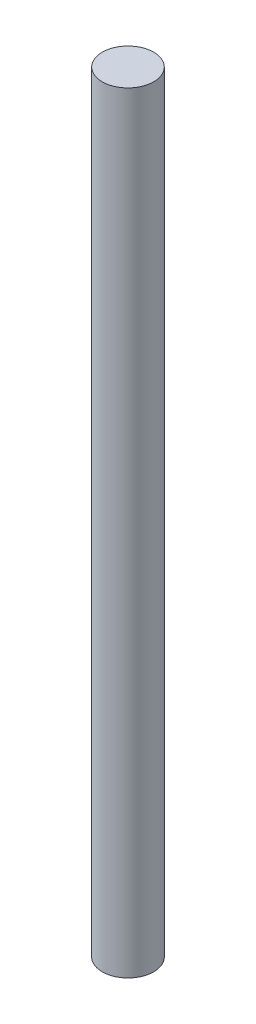
ISO-10303-21;
HEADER;
FILE_DESCRIPTION(('STEP AP214'),'2;1');
FILE_NAME('part.step','',(''),(''),'','','');
FILE_SCHEMA(('AUTOMOTIVE_DESIGN { 1 0 10303 214 1 1 1 1 }'));
ENDSEC;
DATA;
#1=APPLICATION_CONTEXT('core data for automotive mechanical design processes');
#2=APPLICATION_PROTOCOL_DEFINITION('international standard','automotive_design',2000,#1);
#3=PRODUCT_CONTEXT('',#1,'mechanical');
#4=PRODUCT('Part','Part','',(#3));
#5=PRODUCT_RELATED_PRODUCT_CATEGORY('part','',(#4));
#6=PRODUCT_DEFINITION_FORMATION('','',#4);
#7=PRODUCT_DEFINITION_CONTEXT('part definition',#1,'design');
#8=PRODUCT_DEFINITION('design','',#6,#7);
#9=PRODUCT_DEFINITION_SHAPE('','',#8);
#10=(LENGTH_UNIT() NAMED_UNIT(*) SI_UNIT(.MILLI.,.METRE.));
#11=(NAMED_UNIT(*) PLANE_ANGLE_UNIT() SI_UNIT($,.RADIAN.));
#12=(NAMED_UNIT(*) SI_UNIT($,.STERADIAN.) SOLID_ANGLE_UNIT());
#13=UNCERTAINTY_MEASURE_WITH_UNIT(LENGTH_MEASURE(1.E-05),#10,'distance_accuracy_value','');
#14=(GEOMETRIC_REPRESENTATION_CONTEXT(3) GLOBAL_UNCERTAINTY_ASSIGNED_CONTEXT((#13)) GLOBAL_UNIT_ASSIGNED_CONTEXT((#10,
#11,#12)) REPRESENTATION_CONTEXT('',''));
#15=CARTESIAN_POINT('',(0.,0.,0.));
#16=DIRECTION('',(0.,0.,1.));
#17=DIRECTION('',(1.,0.,0.));
#18=AXIS2_PLACEMENT_3D('',#15,#16,#17);
#19=CARTESIAN_POINT('',(0.,37.5,0.));
#20=DIRECTION('',(0.,-1.,0.));
#21=DIRECTION('',(0.,0.,-1.));
#22=AXIS2_PLACEMENT_3D('',#19,#20,#21);
#23=CYLINDRICAL_SURFACE('',#22,2.5);
#24=CARTESIAN_POINT('',(0.,37.5,0.));
#25=DIRECTION('',(0.,1.,0.));
#26=DIRECTION('',(0.,0.,1.));
#27=AXIS2_PLACEMENT_3D('',#24,#25,#26);
#28=CIRCLE('',#27,2.5);
#29=CARTESIAN_POINT('',(0.,37.5,2.5));
#30=VERTEX_POINT('',#29);
#31=EDGE_CURVE('E10',#30,#30,#28,.T.);
#32=ORIENTED_EDGE('',*,*,#31,.F.);
#33=EDGE_LOOP('',(#32));
#34=FACE_BOUND('',#33,.T.);
#35=CARTESIAN_POINT('',(0.,-37.5,0.));
#36=DIRECTION('',(0.,1.,0.));
#37=DIRECTION('',(0.,0.,1.));
#38=AXIS2_PLACEMENT_3D('',#35,#36,#37);
#39=CIRCLE('',#38,2.5);
#40=CARTESIAN_POINT('',(0.,-37.5,2.5));
#41=VERTEX_POINT('',#40);
#42=EDGE_CURVE('E33',#41,#41,#39,.T.);
#43=ORIENTED_EDGE('',*,*,#42,.T.);
#44=EDGE_LOOP('',(#43));
#45=FACE_BOUND('',#44,.T.);
#46=ADVANCED_FACE('F30',(#34,#45),#23,.T.);
#47=CARTESIAN_POINT('',(0.,37.5,0.));
#48=DIRECTION('',(0.,1.,0.));
#49=DIRECTION('',(0.,0.,1.));
#50=AXIS2_PLACEMENT_3D('',#47,#48,#49);
#51=PLANE('',#50);
#52=ORIENTED_EDGE('',*,*,#31,.T.);
#53=EDGE_LOOP('',(#52));
#54=FACE_BOUND('',#53,.T.);
#55=ADVANCED_FACE('F45',(#54),#51,.T.);
#56=CARTESIAN_POINT('',(0.,-37.5,0.));
#57=DIRECTION('',(0.,1.,0.));
#58=DIRECTION('',(0.,0.,1.));
#59=AXIS2_PLACEMENT_3D('',#56,#57,#58);
#60=PLANE('',#59);
#61=ORIENTED_EDGE('',*,*,#42,.F.);
#62=EDGE_LOOP('',(#61));
#63=FACE_BOUND('',#62,.T.);
#64=ADVANCED_FACE('F43',(#63),#60,.F.);
#65=CLOSED_SHELL('',(#46,#55,#64));
#66=MANIFOLD_SOLID_BREP('B2',#65);
#67=ADVANCED_BREP_SHAPE_REPRESENTATION('',(#18,#66),#14);
#68=SHAPE_DEFINITION_REPRESENTATION(#9,#67);
ENDSEC;
END-ISO-10303-21;
